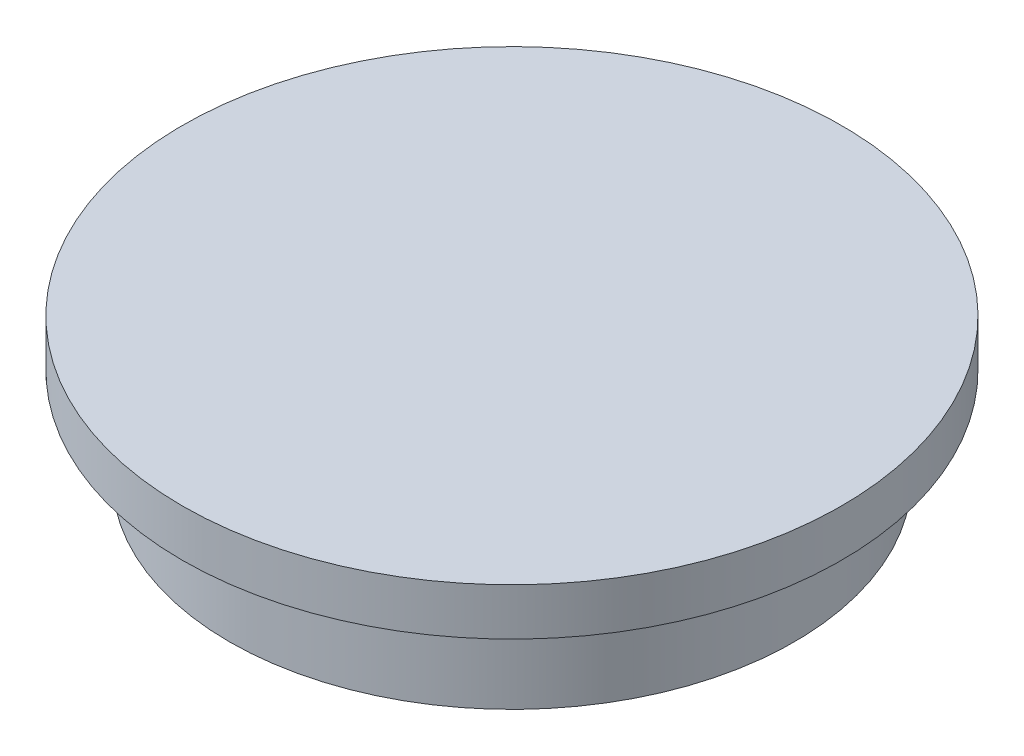
ISO-10303-21;
HEADER;
FILE_DESCRIPTION(('STEP AP214'),'2;1');
FILE_NAME('part.step','',(''),(''),'','','');
FILE_SCHEMA(('AUTOMOTIVE_DESIGN { 1 0 10303 214 1 1 1 1 }'));
ENDSEC;
DATA;
#1=APPLICATION_CONTEXT('core data for automotive mechanical design processes');
#2=APPLICATION_PROTOCOL_DEFINITION('international standard','automotive_design',2000,#1);
#3=PRODUCT_CONTEXT('',#1,'mechanical');
#4=PRODUCT('Part','Part','',(#3));
#5=PRODUCT_RELATED_PRODUCT_CATEGORY('part','',(#4));
#6=PRODUCT_DEFINITION_FORMATION('','',#4);
#7=PRODUCT_DEFINITION_CONTEXT('part definition',#1,'design');
#8=PRODUCT_DEFINITION('design','',#6,#7);
#9=PRODUCT_DEFINITION_SHAPE('','',#8);
#10=(LENGTH_UNIT() NAMED_UNIT(*) SI_UNIT(.MILLI.,.METRE.));
#11=(NAMED_UNIT(*) PLANE_ANGLE_UNIT() SI_UNIT($,.RADIAN.));
#12=(NAMED_UNIT(*) SI_UNIT($,.STERADIAN.) SOLID_ANGLE_UNIT());
#13=UNCERTAINTY_MEASURE_WITH_UNIT(LENGTH_MEASURE(1.E-05),#10,'distance_accuracy_value','');
#14=(GEOMETRIC_REPRESENTATION_CONTEXT(3) GLOBAL_UNCERTAINTY_ASSIGNED_CONTEXT((#13)) GLOBAL_UNIT_ASSIGNED_CONTEXT((#10,
#11,#12)) REPRESENTATION_CONTEXT('',''));
#15=CARTESIAN_POINT('',(0.,0.,0.));
#16=DIRECTION('',(0.,0.,1.));
#17=DIRECTION('',(1.,0.,0.));
#18=AXIS2_PLACEMENT_3D('',#15,#16,#17);
#19=CARTESIAN_POINT('',(0.,2.,0.));
#20=DIRECTION('',(0.,-1.,0.));
#21=DIRECTION('',(0.,0.,-1.));
#22=AXIS2_PLACEMENT_3D('',#19,#20,#21);
#23=CYLINDRICAL_SURFACE('',#22,6.);
#24=CARTESIAN_POINT('',(0.,2.,0.));
#25=DIRECTION('',(0.,1.,0.));
#26=DIRECTION('',(0.,0.,1.));
#27=AXIS2_PLACEMENT_3D('',#24,#25,#26);
#28=CIRCLE('',#27,6.);
#29=CARTESIAN_POINT('',(0.,2.,6.));
#30=VERTEX_POINT('',#29);
#31=EDGE_CURVE('E10',#30,#30,#28,.T.);
#32=ORIENTED_EDGE('',*,*,#31,.F.);
#33=EDGE_LOOP('',(#32));
#34=FACE_BOUND('',#33,.T.);
#35=CARTESIAN_POINT('',(0.,0.,0.));
#36=DIRECTION('',(0.,1.,0.));
#37=DIRECTION('',(0.,0.,1.));
#38=AXIS2_PLACEMENT_3D('',#35,#36,#37);
#39=CIRCLE('',#38,6.);
#40=CARTESIAN_POINT('',(0.,0.,6.));
#41=VERTEX_POINT('',#40);
#42=EDGE_CURVE('E40',#41,#41,#39,.T.);
#43=ORIENTED_EDGE('',*,*,#42,.T.);
#44=EDGE_LOOP('',(#43));
#45=FACE_BOUND('',#44,.T.);
#46=ADVANCED_FACE('F37',(#34,#45),#23,.T.);
#47=CARTESIAN_POINT('',(0.,0.,0.));
#48=DIRECTION('',(0.,1.,0.));
#49=DIRECTION('',(0.,0.,1.));
#50=AXIS2_PLACEMENT_3D('',#47,#48,#49);
#51=PLANE('',#50);
#52=ORIENTED_EDGE('',*,*,#42,.F.);
#53=EDGE_LOOP('',(#52));
#54=FACE_BOUND('',#53,.T.);
#55=ADVANCED_FACE('F64',(#54),#51,.F.);
#56=CARTESIAN_POINT('',(0.,3.,0.));
#57=DIRECTION('',(0.,-1.,0.));
#58=DIRECTION('',(0.,0.,-1.));
#59=AXIS2_PLACEMENT_3D('',#56,#57,#58);
#60=CYLINDRICAL_SURFACE('',#59,7.);
#61=CARTESIAN_POINT('',(0.,3.,0.));
#62=DIRECTION('',(0.,1.,0.));
#63=DIRECTION('',(0.,0.,1.));
#64=AXIS2_PLACEMENT_3D('',#61,#62,#63);
#65=CIRCLE('',#64,7.);
#66=CARTESIAN_POINT('',(0.,3.,7.));
#67=VERTEX_POINT('',#66);
#68=EDGE_CURVE('E49',#67,#67,#65,.T.);
#69=ORIENTED_EDGE('',*,*,#68,.F.);
#70=EDGE_LOOP('',(#69));
#71=FACE_BOUND('',#70,.T.);
#72=CARTESIAN_POINT('',(0.,2.,0.));
#73=DIRECTION('',(0.,1.,0.));
#74=DIRECTION('',(0.,0.,1.));
#75=AXIS2_PLACEMENT_3D('',#72,#73,#74);
#76=CIRCLE('',#75,7.);
#77=CARTESIAN_POINT('',(0.,2.,7.));
#78=VERTEX_POINT('',#77);
#79=EDGE_CURVE('E51',#78,#78,#76,.T.);
#80=ORIENTED_EDGE('',*,*,#79,.T.);
#81=EDGE_LOOP('',(#80));
#82=FACE_BOUND('',#81,.T.);
#83=ADVANCED_FACE('F61',(#71,#82),#60,.T.);
#84=CARTESIAN_POINT('',(0.,3.,0.));
#85=DIRECTION('',(0.,1.,0.));
#86=DIRECTION('',(0.,0.,1.));
#87=AXIS2_PLACEMENT_3D('',#84,#85,#86);
#88=PLANE('',#87);
#89=ORIENTED_EDGE('',*,*,#68,.T.);
#90=EDGE_LOOP('',(#89));
#91=FACE_BOUND('',#90,.T.);
#92=ADVANCED_FACE('F59',(#91),#88,.T.);
#93=CARTESIAN_POINT('',(0.,2.,0.));
#94=DIRECTION('',(0.,1.,0.));
#95=DIRECTION('',(0.,0.,1.));
#96=AXIS2_PLACEMENT_3D('',#93,#94,#95);
#97=PLANE('',#96);
#98=ORIENTED_EDGE('',*,*,#31,.T.);
#99=EDGE_LOOP('',(#98));
#100=FACE_BOUND('',#99,.T.);
#101=ORIENTED_EDGE('',*,*,#79,.F.);
#102=EDGE_LOOP('',(#101));
#103=FACE_BOUND('',#102,.T.);
#104=ADVANCED_FACE('F68',(#100,#103),#97,.F.);
#105=CLOSED_SHELL('',(#46,#55,#83,#92,#104));
#106=MANIFOLD_SOLID_BREP('B2',#105);
#107=ADVANCED_BREP_SHAPE_REPRESENTATION('',(#18,#106),#14);
#108=SHAPE_DEFINITION_REPRESENTATION(#9,#107);
ENDSEC;
END-ISO-10303-21;
